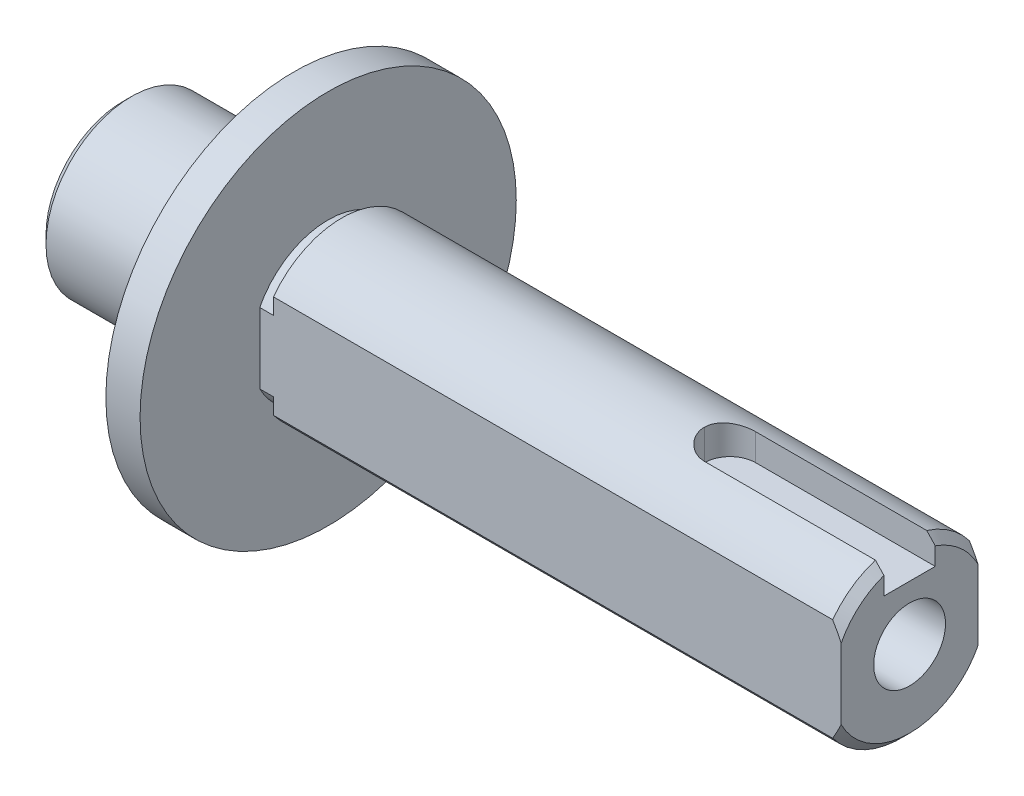
ISO-10303-21;
HEADER;
FILE_DESCRIPTION(('STEP AP214'),'2;1');
FILE_NAME('part.step','',(''),(''),'','','');
FILE_SCHEMA(('AUTOMOTIVE_DESIGN { 1 0 10303 214 1 1 1 1 }'));
ENDSEC;
DATA;
#1=APPLICATION_CONTEXT('core data for automotive mechanical design processes');
#2=APPLICATION_PROTOCOL_DEFINITION('international standard','automotive_design',2000,#1);
#3=PRODUCT_CONTEXT('',#1,'mechanical');
#4=PRODUCT('Part','Part','',(#3));
#5=PRODUCT_RELATED_PRODUCT_CATEGORY('part','',(#4));
#6=PRODUCT_DEFINITION_FORMATION('','',#4);
#7=PRODUCT_DEFINITION_CONTEXT('part definition',#1,'design');
#8=PRODUCT_DEFINITION('design','',#6,#7);
#9=PRODUCT_DEFINITION_SHAPE('','',#8);
#10=(LENGTH_UNIT() NAMED_UNIT(*) SI_UNIT(.MILLI.,.METRE.));
#11=(NAMED_UNIT(*) PLANE_ANGLE_UNIT() SI_UNIT($,.RADIAN.));
#12=(NAMED_UNIT(*) SI_UNIT($,.STERADIAN.) SOLID_ANGLE_UNIT());
#13=UNCERTAINTY_MEASURE_WITH_UNIT(LENGTH_MEASURE(1.E-05),#10,'distance_accuracy_value','');
#14=(GEOMETRIC_REPRESENTATION_CONTEXT(3) GLOBAL_UNCERTAINTY_ASSIGNED_CONTEXT((#13)) GLOBAL_UNIT_ASSIGNED_CONTEXT((#10,
#11,#12)) REPRESENTATION_CONTEXT('',''));
#15=CARTESIAN_POINT('',(0.,0.,0.));
#16=DIRECTION('',(0.,0.,1.));
#17=DIRECTION('',(1.,0.,0.));
#18=AXIS2_PLACEMENT_3D('',#15,#16,#17);
#19=CARTESIAN_POINT('',(34.,0.,0.));
#20=DIRECTION('',(-1.,0.,0.));
#21=DIRECTION('',(0.,0.,1.));
#22=AXIS2_PLACEMENT_3D('',#19,#20,#21);
#23=CYLINDRICAL_SURFACE('',#22,5.);
#24=DIRECTION('',(-1.,0.,0.));
#25=VECTOR('',#24,1.);
#26=CARTESIAN_POINT('',(34.,3.,4.));
#27=LINE('',#26,#25);
#28=CARTESIAN_POINT('',(33.5,3.,4.));
#29=VERTEX_POINT('',#28);
#30=CARTESIAN_POINT('',(0.8,3.,4.));
#31=VERTEX_POINT('',#30);
#32=EDGE_CURVE('E73',#29,#31,#27,.T.);
#33=ORIENTED_EDGE('',*,*,#32,.F.);
#34=CARTESIAN_POINT('',(33.5,0.,0.));
#35=DIRECTION('',(1.,0.,0.));
#36=DIRECTION('',(0.,0.,-1.));
#37=AXIS2_PLACEMENT_3D('',#34,#35,#36);
#38=CIRCLE('',#37,5.);
#39=CARTESIAN_POINT('',(33.5,4.76969600708473,1.5));
#40=VERTEX_POINT('',#39);
#41=EDGE_CURVE('E369',#29,#40,#38,.F.);
#42=ORIENTED_EDGE('',*,*,#41,.T.);
#43=DIRECTION('',(-1.,0.,0.));
#44=VECTOR('',#43,1.);
#45=CARTESIAN_POINT('',(34.,4.76969600708473,1.5));
#46=LINE('',#45,#44);
#47=CARTESIAN_POINT('',(23.5,4.76969600708473,1.5));
#48=VERTEX_POINT('',#47);
#49=EDGE_CURVE('E361',#40,#48,#46,.T.);
#50=ORIENTED_EDGE('',*,*,#49,.T.);
#51=CARTESIAN_POINT('',(23.5,4.76969600708473,1.5));
#52=CARTESIAN_POINT('',(23.4588191893239,4.76969248993095,1.50000085359987));
#53=CARTESIAN_POINT('',(23.4176591211554,4.77023000663726,1.49830305374632));
#54=CARTESIAN_POINT('',(23.3356532031123,4.77235113343356,1.49153727481279));
#55=CARTESIAN_POINT('',(23.2948072846447,4.77393450820429,1.48647005385463));
#56=CARTESIAN_POINT('',(23.1734039562469,4.78018533002168,1.46630065235378));
#57=CARTESIAN_POINT('',(23.0936909396572,4.78635397305578,1.44623028637151));
#58=CARTESIAN_POINT('',(22.9389657187728,4.80195939037487,1.39353147335906));
#59=CARTESIAN_POINT('',(22.8639519621472,4.81139507864529,1.36090719903445));
#60=CARTESIAN_POINT('',(22.7204056008968,4.8324653260204,1.28407985018232));
#61=CARTESIAN_POINT('',(22.651876250842,4.8441009806121,1.23987100279312));
#62=CARTESIAN_POINT('',(22.5211348309649,4.86866818200433,1.13964930893702));
#63=CARTESIAN_POINT('',(22.4591580495003,4.88162718483485,1.08333633607985));
#64=CARTESIAN_POINT('',(22.345365682026,4.90714781796852,0.961140113903201));
#65=CARTESIAN_POINT('',(22.2935520782231,4.9197093703538,0.895255002005046));
#66=CARTESIAN_POINT('',(22.2005222228324,4.94333592434221,0.754090160225412));
#67=CARTESIAN_POINT('',(22.159551096888,4.95436400128813,0.678642338077987));
#68=CARTESIAN_POINT('',(22.0909932692418,4.97335005202751,0.521563369050341));
#69=CARTESIAN_POINT('',(22.0633949729242,4.98131068415015,0.439937649841661));
#70=CARTESIAN_POINT('',(22.0287310388729,4.99143710038863,0.298264456021695));
#71=CARTESIAN_POINT('',(22.0179786341264,4.99462764738926,0.239166490668786));
#72=CARTESIAN_POINT('',(22.0036059826422,4.99891817852599,0.120057391419019));
#73=CARTESIAN_POINT('',(21.9999832582716,5.00001888889584,0.0600465820525052));
#74=CARTESIAN_POINT('',(22.,5.,0.));
#75=B_SPLINE_CURVE_WITH_KNOTS('',3,(#51,#52,#53,#54,#55,#56,#57,#58,#59,#60,#61,#62,#63,#64,#65,
#66,#67,#68,#69,#70,#71,#72,#73,#74),.UNSPECIFIED.,.F.,.F.,(4,2,2,2,2,2,2,2,2,2,2,4),(0.,
0.123463321048068,0.24689887216849,0.492911372366583,0.738842172727395,0.984895759946682,
1.23795183323012,1.49105721311968,1.74947248420819,2.00766329935825,2.1876802778492,
2.36763468764484),.UNSPECIFIED.);
#76=CARTESIAN_POINT('',(22.,5.,0.));
#77=VERTEX_POINT('',#76);
#78=EDGE_CURVE('E325',#48,#77,#75,.T.);
#79=ORIENTED_EDGE('',*,*,#78,.T.);
#80=CARTESIAN_POINT('',(22.,5.,0.));
#81=CARTESIAN_POINT('',(21.9999992591257,5.00000277613312,-0.0412230773899811));
#82=CARTESIAN_POINT('',(22.001700439264,4.99948958398081,-0.0824255570982472));
#83=CARTESIAN_POINT('',(22.008480415993,4.99746087704898,-0.164518730866948));
#84=CARTESIAN_POINT('',(22.0135585422377,4.9959455611979,-0.205409485177794));
#85=CARTESIAN_POINT('',(22.0337751753036,4.98995381331756,-0.326963301776202));
#86=CARTESIAN_POINT('',(22.0538963492236,4.98403118606551,-0.406785158642714));
#87=CARTESIAN_POINT('',(22.1067428791412,4.96895678681408,-0.561734538434265));
#88=CARTESIAN_POINT('',(22.1394655173163,4.95980571114645,-0.636863069535107));
#89=CARTESIAN_POINT('',(22.2165230946765,4.9392243551907,-0.780600785691843));
#90=CARTESIAN_POINT('',(22.2608629308205,4.92779311423826,-0.849207204843492));
#91=CARTESIAN_POINT('',(22.3612215664061,4.90350796272656,-0.97986969539363));
#92=CARTESIAN_POINT('',(22.4175108687189,4.8906250718143,-1.0417124952522));
#93=CARTESIAN_POINT('',(22.5396036263605,4.86505948668359,-1.15524422121796));
#94=CARTESIAN_POINT('',(22.6054095596784,4.85237684556416,-1.20693049442307));
#95=CARTESIAN_POINT('',(22.7464938312308,4.82833698781928,-1.29981663905891));
#96=CARTESIAN_POINT('',(22.8219538970685,4.81701657361783,-1.34075062074078));
#97=CARTESIAN_POINT('',(22.979054827348,4.79742985037451,-1.40923482373452));
#98=CARTESIAN_POINT('',(23.060689789892,4.78916066835566,-1.43679764279335));
#99=CARTESIAN_POINT('',(23.2022679187996,4.77862845517374,-1.47137173672671));
#100=CARTESIAN_POINT('',(23.261253699657,4.77530350348451,-1.48208442594249));
#101=CARTESIAN_POINT('',(23.3801473910673,4.7708262463819,-1.49640626854262));
#102=CARTESIAN_POINT('',(23.4400550940789,4.76967345898471,-1.5000169977961));
#103=CARTESIAN_POINT('',(23.5,4.76969600708473,-1.5));
#104=B_SPLINE_CURVE_WITH_KNOTS('',3,(#80,#81,#82,#83,#84,#85,#86,#87,#88,#89,#90,#91,#92,#93,
#94,#95,#96,#97,#98,#99,#100,#101,#102,#103),.UNSPECIFIED.,.F.,.F.,(4,2,2,2,2,2,2,2,2,2,2,4),
(0.,0.123590522760266,0.247156519315276,0.493467728235494,0.73972584367575,0.98608793095597,
1.23877207809718,1.49152213929097,1.75003354782293,2.00830092246138,2.18798745648376,
2.36763411497588),.UNSPECIFIED.);
#105=CARTESIAN_POINT('',(23.5,4.76969600708473,-1.5));
#106=VERTEX_POINT('',#105);
#107=EDGE_CURVE('E332',#77,#106,#104,.T.);
#108=ORIENTED_EDGE('',*,*,#107,.T.);
#109=DIRECTION('',(-1.,0.,0.));
#110=VECTOR('',#109,1.);
#111=CARTESIAN_POINT('',(34.,4.76969600708473,-1.5));
#112=LINE('',#111,#110);
#113=CARTESIAN_POINT('',(33.5,4.76969600708473,-1.5));
#114=VERTEX_POINT('',#113);
#115=EDGE_CURVE('E372',#114,#106,#112,.T.);
#116=ORIENTED_EDGE('',*,*,#115,.F.);
#117=CARTESIAN_POINT('',(33.5,3.,-4.));
#118=VERTEX_POINT('',#117);
#119=EDGE_CURVE('E290',#114,#118,#38,.F.);
#120=ORIENTED_EDGE('',*,*,#119,.T.);
#121=DIRECTION('',(-1.,0.,0.));
#122=VECTOR('',#121,1.);
#123=CARTESIAN_POINT('',(34.,3.,-4.));
#124=LINE('',#123,#122);
#125=CARTESIAN_POINT('',(0.800000000000002,3.,-4.));
#126=VERTEX_POINT('',#125);
#127=EDGE_CURVE('E193',#118,#126,#124,.T.);
#128=ORIENTED_EDGE('',*,*,#127,.T.);
#129=CARTESIAN_POINT('',(0.8,0.,0.));
#130=DIRECTION('',(-1.,0.,0.));
#131=DIRECTION('',(0.,0.,1.));
#132=AXIS2_PLACEMENT_3D('',#129,#130,#131);
#133=CIRCLE('',#132,5.);
#134=EDGE_CURVE('E457',#31,#126,#133,.T.);
#135=ORIENTED_EDGE('',*,*,#134,.F.);
#136=EDGE_LOOP('',(#33,#42,#50,#79,#108,#116,#120,#128,#135));
#137=FACE_BOUND('',#136,.T.);
#138=ADVANCED_FACE('F48',(#137),#23,.T.);
#139=DIRECTION('',(-1.,0.,0.));
#140=VECTOR('',#139,1.);
#141=CARTESIAN_POINT('',(34.,-3.,4.));
#142=LINE('',#141,#140);
#143=CARTESIAN_POINT('',(33.5,-3.,4.));
#144=VERTEX_POINT('',#143);
#145=CARTESIAN_POINT('',(0.800000000000002,-3.,4.));
#146=VERTEX_POINT('',#145);
#147=EDGE_CURVE('E196',#144,#146,#142,.T.);
#148=ORIENTED_EDGE('',*,*,#147,.T.);
#149=CARTESIAN_POINT('',(0.8,-3.,-4.));
#150=VERTEX_POINT('',#149);
#151=EDGE_CURVE('E435',#150,#146,#133,.T.);
#152=ORIENTED_EDGE('',*,*,#151,.F.);
#153=DIRECTION('',(-1.,0.,0.));
#154=VECTOR('',#153,1.);
#155=CARTESIAN_POINT('',(34.,-3.,-4.));
#156=LINE('',#155,#154);
#157=CARTESIAN_POINT('',(33.5,-3.,-4.));
#158=VERTEX_POINT('',#157);
#159=EDGE_CURVE('E65',#158,#150,#156,.T.);
#160=ORIENTED_EDGE('',*,*,#159,.F.);
#161=EDGE_CURVE('E397',#158,#144,#38,.F.);
#162=ORIENTED_EDGE('',*,*,#161,.T.);
#163=EDGE_LOOP('',(#148,#152,#160,#162));
#164=FACE_BOUND('',#163,.T.);
#165=ADVANCED_FACE('F318',(#164),#23,.T.);
#166=CARTESIAN_POINT('',(34.,0.,0.));
#167=DIRECTION('',(1.,0.,0.));
#168=DIRECTION('',(0.,0.,-1.));
#169=AXIS2_PLACEMENT_3D('',#166,#167,#168);
#170=PLANE('',#169);
#171=CARTESIAN_POINT('',(34.,0.,0.));
#172=DIRECTION('',(1.,0.,0.));
#173=DIRECTION('',(0.,0.,-1.));
#174=AXIS2_PLACEMENT_3D('',#171,#172,#173);
#175=CIRCLE('',#174,2.09999999999999);
#176=CARTESIAN_POINT('',(34.,0.,-2.09999999999999));
#177=VERTEX_POINT('',#176);
#178=EDGE_CURVE('E176',#177,#177,#175,.T.);
#179=ORIENTED_EDGE('',*,*,#178,.F.);
#180=EDGE_LOOP('',(#179));
#181=FACE_BOUND('',#180,.T.);
#182=CARTESIAN_POINT('',(34.,0.,0.));
#183=DIRECTION('',(1.,0.,0.));
#184=DIRECTION('',(0.,0.,-1.));
#185=AXIS2_PLACEMENT_3D('',#182,#183,#184);
#186=CIRCLE('',#185,4.5);
#187=CARTESIAN_POINT('',(34.,4.24264068711929,1.5));
#188=VERTEX_POINT('',#187);
#189=CARTESIAN_POINT('',(34.,2.06155281280883,4.));
#190=VERTEX_POINT('',#189);
#191=EDGE_CURVE('E387',#188,#190,#186,.T.);
#192=ORIENTED_EDGE('',*,*,#191,.T.);
#193=DIRECTION('',(0.,1.,0.));
#194=VECTOR('',#193,1.);
#195=CARTESIAN_POINT('',(34.,3.,4.));
#196=LINE('',#195,#194);
#197=CARTESIAN_POINT('',(34.,-2.06155281280883,4.));
#198=VERTEX_POINT('',#197);
#199=EDGE_CURVE('E186',#198,#190,#196,.T.);
#200=ORIENTED_EDGE('',*,*,#199,.F.);
#201=CARTESIAN_POINT('',(34.,-2.06155281280883,-4.));
#202=VERTEX_POINT('',#201);
#203=EDGE_CURVE('E390',#198,#202,#186,.T.);
#204=ORIENTED_EDGE('',*,*,#203,.T.);
#205=DIRECTION('',(0.,-1.,0.));
#206=VECTOR('',#205,1.);
#207=CARTESIAN_POINT('',(34.,3.,-4.));
#208=LINE('',#207,#206);
#209=CARTESIAN_POINT('',(34.,2.06155281280883,-4.));
#210=VERTEX_POINT('',#209);
#211=EDGE_CURVE('E181',#210,#202,#208,.T.);
#212=ORIENTED_EDGE('',*,*,#211,.F.);
#213=CARTESIAN_POINT('',(34.,4.24264068711929,-1.5));
#214=VERTEX_POINT('',#213);
#215=EDGE_CURVE('E386',#210,#214,#186,.T.);
#216=ORIENTED_EDGE('',*,*,#215,.T.);
#217=DIRECTION('',(0.,-1.,0.));
#218=VECTOR('',#217,1.);
#219=CARTESIAN_POINT('',(34.,5.,-1.5));
#220=LINE('',#219,#218);
#221=CARTESIAN_POINT('',(34.,3.2,-1.5));
#222=VERTEX_POINT('',#221);
#223=EDGE_CURVE('E405',#214,#222,#220,.T.);
#224=ORIENTED_EDGE('',*,*,#223,.T.);
#225=DIRECTION('',(0.,0.,-1.));
#226=VECTOR('',#225,1.);
#227=CARTESIAN_POINT('',(34.,3.2,1.5));
#228=LINE('',#227,#226);
#229=CARTESIAN_POINT('',(34.,3.2,1.5));
#230=VERTEX_POINT('',#229);
#231=EDGE_CURVE('E411',#230,#222,#228,.T.);
#232=ORIENTED_EDGE('',*,*,#231,.F.);
#233=DIRECTION('',(0.,-1.,0.));
#234=VECTOR('',#233,1.);
#235=CARTESIAN_POINT('',(34.,5.,1.5));
#236=LINE('',#235,#234);
#237=EDGE_CURVE('E470',#188,#230,#236,.T.);
#238=ORIENTED_EDGE('',*,*,#237,.F.);
#239=EDGE_LOOP('',(#192,#200,#204,#212,#216,#224,#232,#238));
#240=FACE_BOUND('',#239,.T.);
#241=ADVANCED_FACE('F316',(#181,#240),#170,.T.);
#242=CARTESIAN_POINT('',(34.,0.,0.));
#243=DIRECTION('',(-1.,0.,0.));
#244=DIRECTION('',(0.,0.,1.));
#245=AXIS2_PLACEMENT_3D('',#242,#243,#244);
#246=CONICAL_SURFACE('',#245,4.5,0.785398163397447);
#247=ORIENTED_EDGE('',*,*,#41,.F.);
#248=CARTESIAN_POINT('',(33.4995799686426,3.0007,4.));
#249=CARTESIAN_POINT('',(33.5437467043522,2.92709187405046,4.));
#250=CARTESIAN_POINT('',(33.5871557735142,2.85302985230197,4.));
#251=CARTESIAN_POINT('',(33.6722388842789,2.70389307663398,4.));
#252=CARTESIAN_POINT('',(33.7139125022785,2.62881808131188,4.));
#253=CARTESIAN_POINT('',(33.836275854694,2.40139934046467,4.));
#254=CARTESIAN_POINT('',(33.9139711269826,2.2474161837204,4.));
#255=CARTESIAN_POINT('',(34.0602222881816,1.93172138464277,4.));
#256=CARTESIAN_POINT('',(34.128587278336,1.76992029914698,4.));
#257=CARTESIAN_POINT('',(34.2510327887208,1.44114657037894,4.));
#258=CARTESIAN_POINT('',(34.3051351913796,1.27418229376006,4.));
#259=CARTESIAN_POINT('',(34.3812821985216,0.988169801893597,4.));
#260=CARTESIAN_POINT('',(34.4080634855457,0.870384445096824,4.));
#261=CARTESIAN_POINT('',(34.4519047810558,0.632983979898557,4.));
#262=CARTESIAN_POINT('',(34.4689646743344,0.513368849829799,4.));
#263=CARTESIAN_POINT('',(34.4923665329024,0.274157151227148,4.));
#264=CARTESIAN_POINT('',(34.498802678267,0.154569920976609,4.));
#265=CARTESIAN_POINT('',(34.5008921773473,-0.0846957244836088,4.));
#266=CARTESIAN_POINT('',(34.4965459099783,-0.204374136341234,4.));
#267=CARTESIAN_POINT('',(34.4773318138704,-0.442648913768485,4.));
#268=CARTESIAN_POINT('',(34.4624836089366,-0.561246880239839,4.));
#269=CARTESIAN_POINT('',(34.4230685460445,-0.796789877161253,4.));
#270=CARTESIAN_POINT('',(34.3985006378476,-0.913734727573161,4.));
#271=CARTESIAN_POINT('',(34.3113872623524,-1.26316749594983,4.));
#272=CARTESIAN_POINT('',(34.2356092368305,-1.49240920277536,4.));
#273=CARTESIAN_POINT('',(34.1029193049462,-1.82895497276494,4.));
#274=CARTESIAN_POINT('',(34.0553603477439,-1.94021559418645,4.));
#275=CARTESIAN_POINT('',(33.9549356874383,-2.16036697056156,4.));
#276=CARTESIAN_POINT('',(33.90206903495,-2.26925729728808,4.));
#277=CARTESIAN_POINT('',(33.792856555839,-2.48304859093975,4.));
#278=CARTESIAN_POINT('',(33.7365803352189,-2.58798555057563,4.));
#279=CARTESIAN_POINT('',(33.6205354352826,-2.79580645752841,4.));
#280=CARTESIAN_POINT('',(33.5607695419799,-2.8986919569381,4.));
#281=CARTESIAN_POINT('',(33.4995799686426,-3.0007,4.));
#282=B_SPLINE_CURVE_WITH_KNOTS('',3,(#248,#249,#250,#251,#252,#253,#254,#255,#256,#257,#258,
#259,#260,#261,#262,#263,#264,#265,#266,#267,#268,#269,#270,#271,#272,#273,#274,#275,#276,#277,
#278,#279,#280,#281),.UNSPECIFIED.,.F.,.F.,(4,2,2,2,2,2,2,2,2,2,2,2,2,2,2,2,4),(0.,
0.257517242107802,0.515096977058802,1.03220051563979,1.55866458739502,2.08431616580225,
2.44634173271977,2.80837158988729,3.16717445079311,3.5259647028379,3.8840862885549,
4.24224658078875,4.96406566775581,5.32699296191271,5.68998528874448,6.04714130571684,
6.40401598231456),.UNSPECIFIED.);
#283=EDGE_CURVE('E429',#29,#190,#282,.T.);
#284=ORIENTED_EDGE('',*,*,#283,.T.);
#285=ORIENTED_EDGE('',*,*,#191,.F.);
#286=CARTESIAN_POINT('',(31.6316458307731,6.70255839168426,1.5));
#287=CARTESIAN_POINT('',(31.8123803267365,6.51733755149528,1.5));
#288=CARTESIAN_POINT('',(31.9929469990267,6.33195222922591,1.5));
#289=CARTESIAN_POINT('',(32.3536047230969,5.96071848634781,1.5));
#290=CARTESIAN_POINT('',(32.5336957733682,5.77487006427357,1.5));
#291=CARTESIAN_POINT('',(32.8932083410732,5.40263182040897,1.5));
#292=CARTESIAN_POINT('',(33.0726300395824,5.21624217362223,1.5));
#293=CARTESIAN_POINT('',(33.4306393206229,4.84265210588213,1.5));
#294=CARTESIAN_POINT('',(33.6092268785068,4.6554516612822,1.5));
#295=CARTESIAN_POINT('',(33.965285333419,4.27986143036192,1.5));
#296=CARTESIAN_POINT('',(34.1427558002925,4.09147123590069,1.5));
#297=CARTESIAN_POINT('',(34.4959576432083,3.71308595327028,1.5));
#298=CARTESIAN_POINT('',(34.6716891398876,3.52309097814809,1.5));
#299=CARTESIAN_POINT('',(34.933278583921,3.23620510413929,1.5));
#300=CARTESIAN_POINT('',(35.0201553971391,3.14024402220525,1.5));
#301=CARTESIAN_POINT('',(35.1930205100701,2.94752907377066,1.5));
#302=CARTESIAN_POINT('',(35.2790088351168,2.85077523001628,1.5));
#303=CARTESIAN_POINT('',(35.4498569101993,2.65623165702578,1.5));
#304=CARTESIAN_POINT('',(35.5347163892213,2.55844168881039,1.5));
#305=CARTESIAN_POINT('',(35.7028438730114,2.3614883646636,1.5));
#306=CARTESIAN_POINT('',(35.7861117192461,2.26232487360267,1.5));
#307=CARTESIAN_POINT('',(35.8683541692269,2.16230427521781,1.5));
#308=B_SPLINE_CURVE_WITH_KNOTS('',3,(#286,#287,#288,#289,#290,#291,#292,#293,#294,#295,#296,
#297,#298,#299,#300,#301,#302,#303,#304,#305,#306,#307),.UNSPECIFIED.,.F.,.F.,(4,2,2,2,2,2,2,2,
2,2,4),(0.,0.776367513826785,1.55273748765964,2.32887948544042,3.10504427357708,
3.88149160324206,4.65788468567818,5.04621660351841,5.43453741796582,5.82294983655363,
6.21140074313656),.UNSPECIFIED.);
#309=EDGE_CURVE('E289',#40,#188,#308,.T.);
#310=ORIENTED_EDGE('',*,*,#309,.F.);
#311=EDGE_LOOP('',(#247,#284,#285,#310));
#312=FACE_BOUND('',#311,.T.);
#313=ADVANCED_FACE('F233',(#312),#246,.T.);
#314=ORIENTED_EDGE('',*,*,#203,.F.);
#315=EDGE_CURVE('E427',#198,#144,#282,.T.);
#316=ORIENTED_EDGE('',*,*,#315,.T.);
#317=ORIENTED_EDGE('',*,*,#161,.F.);
#318=CARTESIAN_POINT('',(33.4995799686426,-3.0007,-4.));
#319=CARTESIAN_POINT('',(33.5437467043522,-2.92709187405046,-4.));
#320=CARTESIAN_POINT('',(33.5871557735142,-2.85302985230197,-4.));
#321=CARTESIAN_POINT('',(33.6722388842789,-2.70389307663398,-4.));
#322=CARTESIAN_POINT('',(33.7139125022785,-2.62881808131188,-4.));
#323=CARTESIAN_POINT('',(33.836275854694,-2.40139934046467,-4.));
#324=CARTESIAN_POINT('',(33.9139711269826,-2.2474161837204,-4.));
#325=CARTESIAN_POINT('',(34.0602222881816,-1.93172138464277,-4.));
#326=CARTESIAN_POINT('',(34.128587278336,-1.76992029914698,-4.));
#327=CARTESIAN_POINT('',(34.2510327887208,-1.44114657037894,-4.));
#328=CARTESIAN_POINT('',(34.3051351913796,-1.27418229376006,-4.));
#329=CARTESIAN_POINT('',(34.3812821985216,-0.988169801893597,-4.));
#330=CARTESIAN_POINT('',(34.4080634855457,-0.870384445096824,-4.));
#331=CARTESIAN_POINT('',(34.4519047810558,-0.632983979898557,-4.));
#332=CARTESIAN_POINT('',(34.4689646743344,-0.513368849829799,-4.));
#333=CARTESIAN_POINT('',(34.4923665329024,-0.274157151227148,-4.));
#334=CARTESIAN_POINT('',(34.498802678267,-0.154569920976609,-4.));
#335=CARTESIAN_POINT('',(34.5008921773473,0.0846957244836088,-4.));
#336=CARTESIAN_POINT('',(34.4965459099783,0.204374136341234,-4.));
#337=CARTESIAN_POINT('',(34.4773318138704,0.442648913768485,-4.));
#338=CARTESIAN_POINT('',(34.4624836089366,0.561246880239839,-4.));
#339=CARTESIAN_POINT('',(34.4230685460445,0.796789877161253,-4.));
#340=CARTESIAN_POINT('',(34.3985006378476,0.913734727573161,-4.));
#341=CARTESIAN_POINT('',(34.3113872623524,1.26316749594983,-4.));
#342=CARTESIAN_POINT('',(34.2356092368305,1.49240920277536,-4.));
#343=CARTESIAN_POINT('',(34.1029193049462,1.82895497276494,-4.));
#344=CARTESIAN_POINT('',(34.0553603477439,1.94021559418645,-4.));
#345=CARTESIAN_POINT('',(33.9549356874383,2.16036697056156,-4.));
#346=CARTESIAN_POINT('',(33.90206903495,2.26925729728808,-4.));
#347=CARTESIAN_POINT('',(33.792856555839,2.48304859093975,-4.));
#348=CARTESIAN_POINT('',(33.7365803352189,2.58798555057563,-4.));
#349=CARTESIAN_POINT('',(33.6205354352826,2.79580645752841,-4.));
#350=CARTESIAN_POINT('',(33.5607695419799,2.8986919569381,-4.));
#351=CARTESIAN_POINT('',(33.4995799686426,3.0007,-4.));
#352=B_SPLINE_CURVE_WITH_KNOTS('',3,(#318,#319,#320,#321,#322,#323,#324,#325,#326,#327,#328,
#329,#330,#331,#332,#333,#334,#335,#336,#337,#338,#339,#340,#341,#342,#343,#344,#345,#346,#347,
#348,#349,#350,#351),.UNSPECIFIED.,.F.,.F.,(4,2,2,2,2,2,2,2,2,2,2,2,2,2,2,2,4),(0.,
0.257517242107802,0.515096977058802,1.03220051563979,1.55866458739502,2.08431616580225,
2.44634173271977,2.80837158988729,3.16717445079311,3.5259647028379,3.8840862885549,
4.24224658078875,4.96406566775581,5.32699296191271,5.68998528874448,6.04714130571684,
6.40401598231456),.UNSPECIFIED.);
#353=EDGE_CURVE('E229',#158,#202,#352,.T.);
#354=ORIENTED_EDGE('',*,*,#353,.T.);
#355=EDGE_LOOP('',(#314,#316,#317,#354));
#356=FACE_BOUND('',#355,.T.);
#357=ADVANCED_FACE('F426',(#356),#246,.T.);
#358=ORIENTED_EDGE('',*,*,#215,.F.);
#359=EDGE_CURVE('E219',#210,#118,#352,.T.);
#360=ORIENTED_EDGE('',*,*,#359,.T.);
#361=ORIENTED_EDGE('',*,*,#119,.F.);
#362=CARTESIAN_POINT('',(31.6316458307731,6.70255839168426,-1.5));
#363=CARTESIAN_POINT('',(31.8123803267365,6.51733755149528,-1.5));
#364=CARTESIAN_POINT('',(31.9929469990267,6.33195222922591,-1.5));
#365=CARTESIAN_POINT('',(32.3536047230969,5.96071848634781,-1.5));
#366=CARTESIAN_POINT('',(32.5336957733682,5.77487006427357,-1.5));
#367=CARTESIAN_POINT('',(32.8932083410732,5.40263182040897,-1.5));
#368=CARTESIAN_POINT('',(33.0726300395824,5.21624217362223,-1.5));
#369=CARTESIAN_POINT('',(33.4306393206229,4.84265210588213,-1.5));
#370=CARTESIAN_POINT('',(33.6092268785068,4.6554516612822,-1.5));
#371=CARTESIAN_POINT('',(33.965285333419,4.27986143036192,-1.5));
#372=CARTESIAN_POINT('',(34.1427558002925,4.09147123590069,-1.5));
#373=CARTESIAN_POINT('',(34.4959576432083,3.71308595327028,-1.5));
#374=CARTESIAN_POINT('',(34.6716891398876,3.52309097814809,-1.5));
#375=CARTESIAN_POINT('',(34.933278583921,3.23620510413929,-1.5));
#376=CARTESIAN_POINT('',(35.0201553971391,3.14024402220525,-1.5));
#377=CARTESIAN_POINT('',(35.1930205100701,2.94752907377066,-1.5));
#378=CARTESIAN_POINT('',(35.2790088351168,2.85077523001628,-1.5));
#379=CARTESIAN_POINT('',(35.4498569101993,2.65623165702578,-1.5));
#380=CARTESIAN_POINT('',(35.5347163892213,2.55844168881039,-1.5));
#381=CARTESIAN_POINT('',(35.7028438730114,2.3614883646636,-1.5));
#382=CARTESIAN_POINT('',(35.7861117192461,2.26232487360267,-1.5));
#383=CARTESIAN_POINT('',(35.8683541692269,2.16230427521781,-1.5));
#384=B_SPLINE_CURVE_WITH_KNOTS('',3,(#362,#363,#364,#365,#366,#367,#368,#369,#370,#371,#372,
#373,#374,#375,#376,#377,#378,#379,#380,#381,#382,#383),.UNSPECIFIED.,.F.,.F.,(4,2,2,2,2,2,2,2,
2,2,4),(0.,0.776367513826785,1.55273748765964,2.32887948544042,3.10504427357708,
3.88149160324206,4.65788468567818,5.04621660351841,5.43453741796582,5.82294983655363,
6.21140074313656),.UNSPECIFIED.);
#385=EDGE_CURVE('E280',#114,#214,#384,.T.);
#386=ORIENTED_EDGE('',*,*,#385,.T.);
#387=EDGE_LOOP('',(#358,#360,#361,#386));
#388=FACE_BOUND('',#387,.T.);
#389=ADVANCED_FACE('F262',(#388),#246,.T.);
#390=CARTESIAN_POINT('',(0.,0.,0.));
#391=DIRECTION('',(-1.,0.,0.));
#392=DIRECTION('',(0.,0.,1.));
#393=AXIS2_PLACEMENT_3D('',#390,#391,#392);
#394=CYLINDRICAL_SURFACE('',#393,4.5);
#395=CARTESIAN_POINT('',(0.,0.,0.));
#396=DIRECTION('',(-1.,0.,0.));
#397=DIRECTION('',(0.,0.,1.));
#398=AXIS2_PLACEMENT_3D('',#395,#396,#397);
#399=CIRCLE('',#398,4.5);
#400=CARTESIAN_POINT('',(0.,2.06155281280883,4.));
#401=VERTEX_POINT('',#400);
#402=CARTESIAN_POINT('',(0.,2.06155281280883,-4.));
#403=VERTEX_POINT('',#402);
#404=EDGE_CURVE('E449',#401,#403,#399,.T.);
#405=ORIENTED_EDGE('',*,*,#404,.F.);
#406=DIRECTION('',(-1.,0.,0.));
#407=VECTOR('',#406,1.);
#408=CARTESIAN_POINT('',(0.,2.06155281280883,4.));
#409=LINE('',#408,#407);
#410=CARTESIAN_POINT('',(0.8,2.06155281280883,4.));
#411=VERTEX_POINT('',#410);
#412=EDGE_CURVE('E485',#401,#411,#409,.F.);
#413=ORIENTED_EDGE('',*,*,#412,.T.);
#414=CARTESIAN_POINT('',(0.8,0.,0.));
#415=DIRECTION('',(-1.,0.,0.));
#416=DIRECTION('',(0.,0.,1.));
#417=AXIS2_PLACEMENT_3D('',#414,#415,#416);
#418=CIRCLE('',#417,4.5);
#419=CARTESIAN_POINT('',(0.8,2.06155281280883,-4.));
#420=VERTEX_POINT('',#419);
#421=EDGE_CURVE('E462',#411,#420,#418,.T.);
#422=ORIENTED_EDGE('',*,*,#421,.T.);
#423=DIRECTION('',(-1.,0.,0.));
#424=VECTOR('',#423,1.);
#425=CARTESIAN_POINT('',(0.,2.06155281280883,-4.));
#426=LINE('',#425,#424);
#427=EDGE_CURVE('E215',#420,#403,#426,.T.);
#428=ORIENTED_EDGE('',*,*,#427,.T.);
#429=EDGE_LOOP('',(#405,#413,#422,#428));
#430=FACE_BOUND('',#429,.T.);
#431=ADVANCED_FACE('F259',(#430),#394,.T.);
#432=CARTESIAN_POINT('',(0.8,-2.06155281280883,-4.));
#433=VERTEX_POINT('',#432);
#434=CARTESIAN_POINT('',(0.8,-2.06155281280883,4.));
#435=VERTEX_POINT('',#434);
#436=EDGE_CURVE('E461',#433,#435,#418,.T.);
#437=ORIENTED_EDGE('',*,*,#436,.T.);
#438=DIRECTION('',(-1.,0.,0.));
#439=VECTOR('',#438,1.);
#440=CARTESIAN_POINT('',(0.,-2.06155281280883,4.));
#441=LINE('',#440,#439);
#442=CARTESIAN_POINT('',(0.,-2.06155281280883,4.));
#443=VERTEX_POINT('',#442);
#444=EDGE_CURVE('E430',#435,#443,#441,.T.);
#445=ORIENTED_EDGE('',*,*,#444,.T.);
#446=CARTESIAN_POINT('',(0.,-2.06155281280883,-4.));
#447=VERTEX_POINT('',#446);
#448=EDGE_CURVE('E466',#447,#443,#399,.T.);
#449=ORIENTED_EDGE('',*,*,#448,.F.);
#450=DIRECTION('',(-1.,0.,0.));
#451=VECTOR('',#450,1.);
#452=CARTESIAN_POINT('',(0.,-2.06155281280883,-4.));
#453=LINE('',#452,#451);
#454=EDGE_CURVE('E210',#447,#433,#453,.F.);
#455=ORIENTED_EDGE('',*,*,#454,.T.);
#456=EDGE_LOOP('',(#437,#445,#449,#455));
#457=FACE_BOUND('',#456,.T.);
#458=ADVANCED_FACE('F257',(#457),#394,.T.);
#459=CARTESIAN_POINT('',(0.8,5.,0.));
#460=DIRECTION('',(-1.,0.,0.));
#461=DIRECTION('',(0.,0.,1.));
#462=AXIS2_PLACEMENT_3D('',#459,#460,#461);
#463=PLANE('',#462);
#464=ORIENTED_EDGE('',*,*,#151,.T.);
#465=DIRECTION('',(0.,1.,0.));
#466=VECTOR('',#465,1.);
#467=CARTESIAN_POINT('',(0.8,5.,4.));
#468=LINE('',#467,#466);
#469=EDGE_CURVE('E437',#146,#435,#468,.T.);
#470=ORIENTED_EDGE('',*,*,#469,.T.);
#471=ORIENTED_EDGE('',*,*,#436,.F.);
#472=DIRECTION('',(0.,-1.,0.));
#473=VECTOR('',#472,1.);
#474=CARTESIAN_POINT('',(0.8,5.,-4.));
#475=LINE('',#474,#473);
#476=EDGE_CURVE('E200',#433,#150,#475,.T.);
#477=ORIENTED_EDGE('',*,*,#476,.T.);
#478=EDGE_LOOP('',(#464,#470,#471,#477));
#479=FACE_BOUND('',#478,.T.);
#480=ADVANCED_FACE('F253',(#479),#463,.T.);
#481=ORIENTED_EDGE('',*,*,#421,.F.);
#482=EDGE_CURVE('E230',#411,#31,#468,.T.);
#483=ORIENTED_EDGE('',*,*,#482,.T.);
#484=ORIENTED_EDGE('',*,*,#134,.T.);
#485=EDGE_CURVE('E211',#126,#420,#475,.T.);
#486=ORIENTED_EDGE('',*,*,#485,.T.);
#487=EDGE_LOOP('',(#481,#483,#484,#486));
#488=FACE_BOUND('',#487,.T.);
#489=ADVANCED_FACE('F256',(#488),#463,.T.);
#490=CARTESIAN_POINT('',(22.,5.,1.5));
#491=DIRECTION('',(0.,0.,1.));
#492=DIRECTION('',(0.,-1.,0.));
#493=AXIS2_PLACEMENT_3D('',#490,#491,#492);
#494=PLANE('',#493);
#495=DIRECTION('',(1.,0.,0.));
#496=VECTOR('',#495,1.);
#497=CARTESIAN_POINT('',(22.,3.2,1.5));
#498=LINE('',#497,#496);
#499=CARTESIAN_POINT('',(23.5,3.2,1.5));
#500=VERTEX_POINT('',#499);
#501=EDGE_CURVE('E364',#500,#230,#498,.T.);
#502=ORIENTED_EDGE('',*,*,#501,.F.);
#503=DIRECTION('',(0.,-1.,0.));
#504=VECTOR('',#503,1.);
#505=CARTESIAN_POINT('',(23.5,5.,1.5));
#506=LINE('',#505,#504);
#507=EDGE_CURVE('E353',#500,#48,#506,.F.);
#508=ORIENTED_EDGE('',*,*,#507,.T.);
#509=ORIENTED_EDGE('',*,*,#49,.F.);
#510=ORIENTED_EDGE('',*,*,#309,.T.);
#511=ORIENTED_EDGE('',*,*,#237,.T.);
#512=EDGE_LOOP('',(#502,#508,#509,#510,#511));
#513=FACE_BOUND('',#512,.T.);
#514=ADVANCED_FACE('F276',(#513),#494,.F.);
#515=CARTESIAN_POINT('',(22.,5.,-1.5));
#516=DIRECTION('',(0.,0.,1.));
#517=DIRECTION('',(0.,-1.,0.));
#518=AXIS2_PLACEMENT_3D('',#515,#516,#517);
#519=PLANE('',#518);
#520=ORIENTED_EDGE('',*,*,#115,.T.);
#521=DIRECTION('',(0.,-1.,0.));
#522=VECTOR('',#521,1.);
#523=CARTESIAN_POINT('',(23.5,3.2,-1.5));
#524=LINE('',#523,#522);
#525=CARTESIAN_POINT('',(23.5,3.2,-1.5));
#526=VERTEX_POINT('',#525);
#527=EDGE_CURVE('E358',#106,#526,#524,.T.);
#528=ORIENTED_EDGE('',*,*,#527,.T.);
#529=DIRECTION('',(1.,0.,0.));
#530=VECTOR('',#529,1.);
#531=CARTESIAN_POINT('',(22.,3.2,-1.5));
#532=LINE('',#531,#530);
#533=EDGE_CURVE('E380',#526,#222,#532,.T.);
#534=ORIENTED_EDGE('',*,*,#533,.T.);
#535=ORIENTED_EDGE('',*,*,#223,.F.);
#536=ORIENTED_EDGE('',*,*,#385,.F.);
#537=EDGE_LOOP('',(#520,#528,#534,#535,#536));
#538=FACE_BOUND('',#537,.T.);
#539=ADVANCED_FACE('F271',(#538),#519,.T.);
#540=CARTESIAN_POINT('',(22.,3.2,1.5));
#541=DIRECTION('',(0.,-1.,0.));
#542=DIRECTION('',(0.,0.,-1.));
#543=AXIS2_PLACEMENT_3D('',#540,#541,#542);
#544=PLANE('',#543);
#545=CARTESIAN_POINT('',(23.5,3.2,0.));
#546=DIRECTION('',(0.,-1.,0.));
#547=DIRECTION('',(0.,0.,-1.));
#548=AXIS2_PLACEMENT_3D('',#545,#546,#547);
#549=CIRCLE('',#548,1.5);
#550=CARTESIAN_POINT('',(22.,3.2,0.));
#551=VERTEX_POINT('',#550);
#552=EDGE_CURVE('E298',#526,#551,#549,.F.);
#553=ORIENTED_EDGE('',*,*,#552,.T.);
#554=CARTESIAN_POINT('',(23.5,3.2,0.));
#555=DIRECTION('',(0.,-1.,0.));
#556=DIRECTION('',(0.,0.,-1.));
#557=AXIS2_PLACEMENT_3D('',#554,#555,#556);
#558=CIRCLE('',#557,1.5);
#559=EDGE_CURVE('E366',#551,#500,#558,.F.);
#560=ORIENTED_EDGE('',*,*,#559,.T.);
#561=ORIENTED_EDGE('',*,*,#501,.T.);
#562=ORIENTED_EDGE('',*,*,#231,.T.);
#563=ORIENTED_EDGE('',*,*,#533,.F.);
#564=EDGE_LOOP('',(#553,#560,#561,#562,#563));
#565=FACE_BOUND('',#564,.T.);
#566=ADVANCED_FACE('F275',(#565),#544,.F.);
#567=CARTESIAN_POINT('',(23.5,5.,0.));
#568=DIRECTION('',(0.,1.,0.));
#569=DIRECTION('',(0.,0.,1.));
#570=AXIS2_PLACEMENT_3D('',#567,#568,#569);
#571=CYLINDRICAL_SURFACE('',#570,1.5);
#572=ORIENTED_EDGE('',*,*,#527,.F.);
#573=ORIENTED_EDGE('',*,*,#107,.F.);
#574=DIRECTION('',(0.,-1.,0.));
#575=VECTOR('',#574,1.);
#576=CARTESIAN_POINT('',(22.,4.76969600708473,0.));
#577=LINE('',#576,#575);
#578=EDGE_CURVE('E339',#551,#77,#577,.F.);
#579=ORIENTED_EDGE('',*,*,#578,.F.);
#580=ORIENTED_EDGE('',*,*,#552,.F.);
#581=EDGE_LOOP('',(#572,#573,#579,#580));
#582=FACE_BOUND('',#581,.T.);
#583=ADVANCED_FACE('F340',(#582),#571,.F.);
#584=CARTESIAN_POINT('',(23.5,0.,0.));
#585=DIRECTION('',(0.,-1.,0.));
#586=DIRECTION('',(0.,0.,-1.));
#587=AXIS2_PLACEMENT_3D('',#584,#585,#586);
#588=CYLINDRICAL_SURFACE('',#587,1.5);
#589=ORIENTED_EDGE('',*,*,#78,.F.);
#590=ORIENTED_EDGE('',*,*,#507,.F.);
#591=ORIENTED_EDGE('',*,*,#559,.F.);
#592=ORIENTED_EDGE('',*,*,#578,.T.);
#593=EDGE_LOOP('',(#589,#590,#591,#592));
#594=FACE_BOUND('',#593,.T.);
#595=ADVANCED_FACE('F311',(#594),#588,.F.);
#596=CARTESIAN_POINT('',(0.,0.,0.));
#597=DIRECTION('',(-1.,0.,0.));
#598=DIRECTION('',(0.,0.,1.));
#599=AXIS2_PLACEMENT_3D('',#596,#597,#598);
#600=PLANE('',#599);
#601=ORIENTED_EDGE('',*,*,#448,.T.);
#602=DIRECTION('',(0.,1.,0.));
#603=VECTOR('',#602,1.);
#604=CARTESIAN_POINT('',(0.,3.,4.));
#605=LINE('',#604,#603);
#606=EDGE_CURVE('E189',#443,#401,#605,.T.);
#607=ORIENTED_EDGE('',*,*,#606,.T.);
#608=ORIENTED_EDGE('',*,*,#404,.T.);
#609=DIRECTION('',(0.,-1.,0.));
#610=VECTOR('',#609,1.);
#611=CARTESIAN_POINT('',(0.,3.,-4.));
#612=LINE('',#611,#610);
#613=EDGE_CURVE('E175',#403,#447,#612,.T.);
#614=ORIENTED_EDGE('',*,*,#613,.T.);
#615=EDGE_LOOP('',(#601,#607,#608,#614));
#616=FACE_BOUND('',#615,.T.);
#617=CARTESIAN_POINT('',(0.,0.,0.));
#618=DIRECTION('',(-1.,0.,0.));
#619=DIRECTION('',(0.,0.,1.));
#620=AXIS2_PLACEMENT_3D('',#617,#618,#619);
#621=CIRCLE('',#620,11.);
#622=CARTESIAN_POINT('',(0.,0.,11.));
#623=VERTEX_POINT('',#622);
#624=EDGE_CURVE('E371',#623,#623,#621,.T.);
#625=ORIENTED_EDGE('',*,*,#624,.F.);
#626=EDGE_LOOP('',(#625));
#627=FACE_BOUND('',#626,.T.);
#628=ADVANCED_FACE('F308',(#616,#627),#600,.F.);
#629=CARTESIAN_POINT('',(-2.,0.,0.));
#630=DIRECTION('',(1.,0.,0.));
#631=DIRECTION('',(0.,0.,-1.));
#632=AXIS2_PLACEMENT_3D('',#629,#630,#631);
#633=CYLINDRICAL_SURFACE('',#632,11.);
#634=CARTESIAN_POINT('',(-2.,0.,0.));
#635=DIRECTION('',(-1.,0.,0.));
#636=DIRECTION('',(0.,0.,1.));
#637=AXIS2_PLACEMENT_3D('',#634,#635,#636);
#638=CIRCLE('',#637,11.);
#639=CARTESIAN_POINT('',(-2.,0.,11.));
#640=VERTEX_POINT('',#639);
#641=EDGE_CURVE('E377',#640,#640,#638,.T.);
#642=ORIENTED_EDGE('',*,*,#641,.F.);
#643=EDGE_LOOP('',(#642));
#644=FACE_BOUND('',#643,.T.);
#645=ORIENTED_EDGE('',*,*,#624,.T.);
#646=EDGE_LOOP('',(#645));
#647=FACE_BOUND('',#646,.T.);
#648=ADVANCED_FACE('F306',(#644,#647),#633,.T.);
#649=CARTESIAN_POINT('',(-2.,0.,0.));
#650=DIRECTION('',(-1.,0.,0.));
#651=DIRECTION('',(0.,0.,1.));
#652=AXIS2_PLACEMENT_3D('',#649,#650,#651);
#653=PLANE('',#652);
#654=ORIENTED_EDGE('',*,*,#641,.T.);
#655=EDGE_LOOP('',(#654));
#656=FACE_BOUND('',#655,.T.);
#657=CARTESIAN_POINT('',(-2.,0.,0.));
#658=DIRECTION('',(-1.,0.,0.));
#659=DIRECTION('',(0.,0.,1.));
#660=AXIS2_PLACEMENT_3D('',#657,#658,#659);
#661=CIRCLE('',#660,4.5);
#662=CARTESIAN_POINT('',(-2.,0.,4.5));
#663=VERTEX_POINT('',#662);
#664=EDGE_CURVE('E453',#663,#663,#661,.T.);
#665=ORIENTED_EDGE('',*,*,#664,.F.);
#666=EDGE_LOOP('',(#665));
#667=FACE_BOUND('',#666,.T.);
#668=ADVANCED_FACE('F251',(#656,#667),#653,.T.);
#669=CARTESIAN_POINT('',(0.,0.,0.));
#670=DIRECTION('',(-1.,0.,0.));
#671=DIRECTION('',(0.,0.,1.));
#672=AXIS2_PLACEMENT_3D('',#669,#670,#671);
#673=CYLINDRICAL_SURFACE('',#672,4.5);
#674=ORIENTED_EDGE('',*,*,#664,.T.);
#675=EDGE_LOOP('',(#674));
#676=FACE_BOUND('',#675,.T.);
#677=CARTESIAN_POINT('',(-2.8,0.,0.));
#678=DIRECTION('',(-1.,0.,0.));
#679=DIRECTION('',(0.,0.,1.));
#680=AXIS2_PLACEMENT_3D('',#677,#678,#679);
#681=CIRCLE('',#680,4.5);
#682=CARTESIAN_POINT('',(-2.8,0.,4.5));
#683=VERTEX_POINT('',#682);
#684=EDGE_CURVE('E448',#683,#683,#681,.T.);
#685=ORIENTED_EDGE('',*,*,#684,.F.);
#686=EDGE_LOOP('',(#685));
#687=FACE_BOUND('',#686,.T.);
#688=ADVANCED_FACE('F247',(#676,#687),#673,.T.);
#689=CARTESIAN_POINT('',(-2.8,5.,0.));
#690=DIRECTION('',(1.,0.,0.));
#691=DIRECTION('',(0.,0.,-1.));
#692=AXIS2_PLACEMENT_3D('',#689,#690,#691);
#693=PLANE('',#692);
#694=ORIENTED_EDGE('',*,*,#684,.T.);
#695=EDGE_LOOP('',(#694));
#696=FACE_BOUND('',#695,.T.);
#697=CARTESIAN_POINT('',(-2.8,0.,0.));
#698=DIRECTION('',(-1.,0.,0.));
#699=DIRECTION('',(0.,0.,1.));
#700=AXIS2_PLACEMENT_3D('',#697,#698,#699);
#701=CIRCLE('',#700,5.);
#702=CARTESIAN_POINT('',(-2.8,0.,5.));
#703=VERTEX_POINT('',#702);
#704=EDGE_CURVE('E444',#703,#703,#701,.T.);
#705=ORIENTED_EDGE('',*,*,#704,.F.);
#706=EDGE_LOOP('',(#705));
#707=FACE_BOUND('',#706,.T.);
#708=ADVANCED_FACE('F243',(#696,#707),#693,.T.);
#709=CARTESIAN_POINT('',(-12.,0.,0.));
#710=DIRECTION('',(-1.,0.,0.));
#711=DIRECTION('',(0.,0.,1.));
#712=AXIS2_PLACEMENT_3D('',#709,#710,#711);
#713=PLANE('',#712);
#714=CARTESIAN_POINT('',(-12.,0.,0.));
#715=DIRECTION('',(-1.,0.,0.));
#716=DIRECTION('',(0.,0.,1.));
#717=AXIS2_PLACEMENT_3D('',#714,#715,#716);
#718=CIRCLE('',#717,4.5);
#719=CARTESIAN_POINT('',(-12.,0.,4.5));
#720=VERTEX_POINT('',#719);
#721=EDGE_CURVE('E58',#720,#720,#718,.T.);
#722=ORIENTED_EDGE('',*,*,#721,.T.);
#723=EDGE_LOOP('',(#722));
#724=FACE_BOUND('',#723,.T.);
#725=ADVANCED_FACE('F246',(#724),#713,.T.);
#726=CARTESIAN_POINT('',(-12.,0.,0.));
#727=DIRECTION('',(1.,0.,0.));
#728=DIRECTION('',(0.,0.,-1.));
#729=AXIS2_PLACEMENT_3D('',#726,#727,#728);
#730=CYLINDRICAL_SURFACE('',#729,5.);
#731=CARTESIAN_POINT('',(-11.5,0.,0.));
#732=DIRECTION('',(-1.,0.,0.));
#733=DIRECTION('',(0.,0.,1.));
#734=AXIS2_PLACEMENT_3D('',#731,#732,#733);
#735=CIRCLE('',#734,5.);
#736=CARTESIAN_POINT('',(-11.5,0.,5.));
#737=VERTEX_POINT('',#736);
#738=EDGE_CURVE('E12',#737,#737,#735,.F.);
#739=ORIENTED_EDGE('',*,*,#738,.T.);
#740=EDGE_LOOP('',(#739));
#741=FACE_BOUND('',#740,.T.);
#742=ORIENTED_EDGE('',*,*,#704,.T.);
#743=EDGE_LOOP('',(#742));
#744=FACE_BOUND('',#743,.T.);
#745=ADVANCED_FACE('F266',(#741,#744),#730,.T.);
#746=CARTESIAN_POINT('',(-12.,0.,0.));
#747=DIRECTION('',(1.,0.,0.));
#748=DIRECTION('',(0.,0.,-1.));
#749=AXIS2_PLACEMENT_3D('',#746,#747,#748);
#750=CONICAL_SURFACE('',#749,4.5,0.785398163397444);
#751=ORIENTED_EDGE('',*,*,#738,.F.);
#752=EDGE_LOOP('',(#751));
#753=FACE_BOUND('',#752,.T.);
#754=ORIENTED_EDGE('',*,*,#721,.F.);
#755=EDGE_LOOP('',(#754));
#756=FACE_BOUND('',#755,.T.);
#757=ADVANCED_FACE('F51',(#753,#756),#750,.T.);
#758=CARTESIAN_POINT('',(34.,3.,-4.));
#759=DIRECTION('',(0.,0.,-1.));
#760=DIRECTION('',(-1.,0.,0.));
#761=AXIS2_PLACEMENT_3D('',#758,#759,#760);
#762=PLANE('',#761);
#763=ORIENTED_EDGE('',*,*,#159,.T.);
#764=ORIENTED_EDGE('',*,*,#476,.F.);
#765=ORIENTED_EDGE('',*,*,#454,.F.);
#766=ORIENTED_EDGE('',*,*,#613,.F.);
#767=ORIENTED_EDGE('',*,*,#427,.F.);
#768=ORIENTED_EDGE('',*,*,#485,.F.);
#769=ORIENTED_EDGE('',*,*,#127,.F.);
#770=ORIENTED_EDGE('',*,*,#359,.F.);
#771=ORIENTED_EDGE('',*,*,#211,.T.);
#772=ORIENTED_EDGE('',*,*,#353,.F.);
#773=EDGE_LOOP('',(#763,#764,#765,#766,#767,#768,#769,#770,#771,#772));
#774=FACE_BOUND('',#773,.T.);
#775=ADVANCED_FACE('F237',(#774),#762,.T.);
#776=CARTESIAN_POINT('',(34.,3.,4.));
#777=DIRECTION('',(0.,0.,1.));
#778=DIRECTION('',(1.,0.,0.));
#779=AXIS2_PLACEMENT_3D('',#776,#777,#778);
#780=PLANE('',#779);
#781=ORIENTED_EDGE('',*,*,#32,.T.);
#782=ORIENTED_EDGE('',*,*,#482,.F.);
#783=ORIENTED_EDGE('',*,*,#412,.F.);
#784=ORIENTED_EDGE('',*,*,#606,.F.);
#785=ORIENTED_EDGE('',*,*,#444,.F.);
#786=ORIENTED_EDGE('',*,*,#469,.F.);
#787=ORIENTED_EDGE('',*,*,#147,.F.);
#788=ORIENTED_EDGE('',*,*,#315,.F.);
#789=ORIENTED_EDGE('',*,*,#199,.T.);
#790=ORIENTED_EDGE('',*,*,#283,.F.);
#791=EDGE_LOOP('',(#781,#782,#783,#784,#785,#786,#787,#788,#789,#790));
#792=FACE_BOUND('',#791,.T.);
#793=ADVANCED_FACE('F168',(#792),#780,.T.);
#794=CARTESIAN_POINT('',(14.,0.,0.));
#795=DIRECTION('',(1.,0.,0.));
#796=DIRECTION('',(0.,0.,-1.));
#797=AXIS2_PLACEMENT_3D('',#794,#795,#796);
#798=CONICAL_SURFACE('',#797,2.09999999999998,1.02974425867665);
#799=CARTESIAN_POINT('',(12.7381927000421,0.,0.));
#800=VERTEX_POINT('',#799);
#801=VERTEX_LOOP('',#800);
#802=FACE_BOUND('',#801,.T.);
#803=CARTESIAN_POINT('',(14.,0.,0.));
#804=DIRECTION('',(1.,0.,0.));
#805=DIRECTION('',(0.,0.,-1.));
#806=AXIS2_PLACEMENT_3D('',#803,#804,#805);
#807=CIRCLE('',#806,2.09999999999998);
#808=CARTESIAN_POINT('',(14.,0.,-2.09999999999998));
#809=VERTEX_POINT('',#808);
#810=EDGE_CURVE('E172',#809,#809,#807,.T.);
#811=ORIENTED_EDGE('',*,*,#810,.T.);
#812=EDGE_LOOP('',(#811));
#813=FACE_BOUND('',#812,.T.);
#814=ADVANCED_FACE('F164',(#802,#813),#798,.F.);
#815=CARTESIAN_POINT('',(34.,0.,0.));
#816=DIRECTION('',(1.,0.,0.));
#817=DIRECTION('',(0.,0.,-1.));
#818=AXIS2_PLACEMENT_3D('',#815,#816,#817);
#819=CYLINDRICAL_SURFACE('',#818,2.09999999999999);
#820=ORIENTED_EDGE('',*,*,#810,.F.);
#821=EDGE_LOOP('',(#820));
#822=FACE_BOUND('',#821,.T.);
#823=ORIENTED_EDGE('',*,*,#178,.T.);
#824=EDGE_LOOP('',(#823));
#825=FACE_BOUND('',#824,.T.);
#826=ADVANCED_FACE('F167',(#822,#825),#819,.F.);
#827=CLOSED_SHELL('',(#138,#165,#241,#313,#357,#389,#431,#458,#480,#489,#514,#539,#566,#583,
#595,#628,#648,#668,#688,#708,#725,#745,#757,#775,#793,#814,#826));
#828=MANIFOLD_SOLID_BREP('B2',#827);
#829=ADVANCED_BREP_SHAPE_REPRESENTATION('',(#18,#828),#14);
#830=SHAPE_DEFINITION_REPRESENTATION(#9,#829);
ENDSEC;
END-ISO-10303-21;
